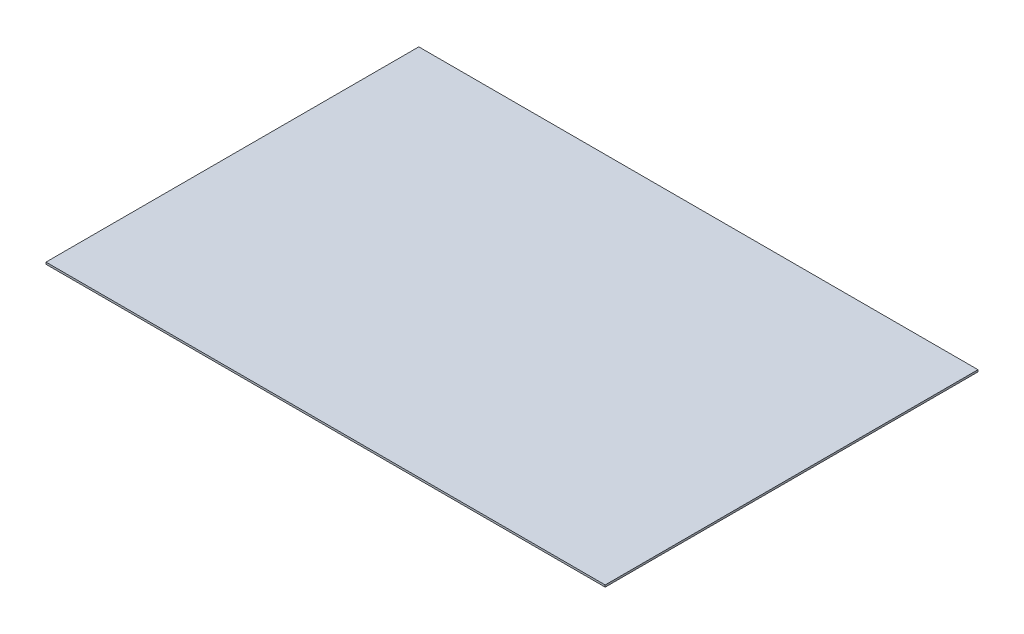
ISO-10303-21;
HEADER;
FILE_DESCRIPTION(('STEP AP214'),'2;1');
FILE_NAME('part.step','',(''),(''),'','','');
FILE_SCHEMA(('AUTOMOTIVE_DESIGN { 1 0 10303 214 1 1 1 1 }'));
ENDSEC;
DATA;
#1=APPLICATION_CONTEXT('core data for automotive mechanical design processes');
#2=APPLICATION_PROTOCOL_DEFINITION('international standard','automotive_design',2000,#1);
#3=PRODUCT_CONTEXT('',#1,'mechanical');
#4=PRODUCT('Part','Part','',(#3));
#5=PRODUCT_RELATED_PRODUCT_CATEGORY('part','',(#4));
#6=PRODUCT_DEFINITION_FORMATION('','',#4);
#7=PRODUCT_DEFINITION_CONTEXT('part definition',#1,'design');
#8=PRODUCT_DEFINITION('design','',#6,#7);
#9=PRODUCT_DEFINITION_SHAPE('','',#8);
#10=(LENGTH_UNIT() NAMED_UNIT(*) SI_UNIT(.MILLI.,.METRE.));
#11=(NAMED_UNIT(*) PLANE_ANGLE_UNIT() SI_UNIT($,.RADIAN.));
#12=(NAMED_UNIT(*) SI_UNIT($,.STERADIAN.) SOLID_ANGLE_UNIT());
#13=UNCERTAINTY_MEASURE_WITH_UNIT(LENGTH_MEASURE(1.E-05),#10,'distance_accuracy_value','');
#14=(GEOMETRIC_REPRESENTATION_CONTEXT(3) GLOBAL_UNCERTAINTY_ASSIGNED_CONTEXT((#13)) GLOBAL_UNIT_ASSIGNED_CONTEXT((#10,
#11,#12)) REPRESENTATION_CONTEXT('',''));
#15=CARTESIAN_POINT('',(0.,0.,0.));
#16=DIRECTION('',(0.,0.,1.));
#17=DIRECTION('',(1.,0.,0.));
#18=AXIS2_PLACEMENT_3D('',#15,#16,#17);
#19=CARTESIAN_POINT('',(914.4,6.35,-609.6));
#20=DIRECTION('',(-1.,0.,0.));
#21=DIRECTION('',(0.,0.,1.));
#22=AXIS2_PLACEMENT_3D('',#19,#20,#21);
#23=PLANE('',#22);
#24=DIRECTION('',(0.,0.,-1.));
#25=VECTOR('',#24,1.);
#26=CARTESIAN_POINT('',(914.4,0.,-609.6));
#27=LINE('',#26,#25);
#28=CARTESIAN_POINT('',(914.4,0.,609.6));
#29=VERTEX_POINT('',#28);
#30=CARTESIAN_POINT('',(914.4,0.,-609.6));
#31=VERTEX_POINT('',#30);
#32=EDGE_CURVE('E98',#29,#31,#27,.T.);
#33=ORIENTED_EDGE('',*,*,#32,.T.);
#34=DIRECTION('',(0.,-1.,0.));
#35=VECTOR('',#34,1.);
#36=CARTESIAN_POINT('',(914.4,6.35,-609.6));
#37=LINE('',#36,#35);
#38=CARTESIAN_POINT('',(914.4,6.35,-609.6));
#39=VERTEX_POINT('',#38);
#40=EDGE_CURVE('E11',#39,#31,#37,.T.);
#41=ORIENTED_EDGE('',*,*,#40,.F.);
#42=DIRECTION('',(0.,0.,-1.));
#43=VECTOR('',#42,1.);
#44=CARTESIAN_POINT('',(914.4,6.35,-609.6));
#45=LINE('',#44,#43);
#46=CARTESIAN_POINT('',(914.4,6.35,609.6));
#47=VERTEX_POINT('',#46);
#48=EDGE_CURVE('E86',#47,#39,#45,.T.);
#49=ORIENTED_EDGE('',*,*,#48,.F.);
#50=DIRECTION('',(0.,-1.,0.));
#51=VECTOR('',#50,1.);
#52=CARTESIAN_POINT('',(914.4,6.35,609.6));
#53=LINE('',#52,#51);
#54=EDGE_CURVE('E94',#47,#29,#53,.T.);
#55=ORIENTED_EDGE('',*,*,#54,.T.);
#56=EDGE_LOOP('',(#33,#41,#49,#55));
#57=FACE_BOUND('',#56,.T.);
#58=ADVANCED_FACE('F35',(#57),#23,.F.);
#59=CARTESIAN_POINT('',(-914.4,6.35,-609.6));
#60=DIRECTION('',(0.,0.,1.));
#61=DIRECTION('',(1.,0.,0.));
#62=AXIS2_PLACEMENT_3D('',#59,#60,#61);
#63=PLANE('',#62);
#64=DIRECTION('',(-1.,0.,0.));
#65=VECTOR('',#64,1.);
#66=CARTESIAN_POINT('',(-914.4,0.,-609.6));
#67=LINE('',#66,#65);
#68=CARTESIAN_POINT('',(-914.4,0.,-609.6));
#69=VERTEX_POINT('',#68);
#70=EDGE_CURVE('E90',#31,#69,#67,.T.);
#71=ORIENTED_EDGE('',*,*,#70,.T.);
#72=DIRECTION('',(0.,-1.,0.));
#73=VECTOR('',#72,1.);
#74=CARTESIAN_POINT('',(-914.4,6.35,-609.6));
#75=LINE('',#74,#73);
#76=CARTESIAN_POINT('',(-914.4,6.35,-609.6));
#77=VERTEX_POINT('',#76);
#78=EDGE_CURVE('E43',#77,#69,#75,.T.);
#79=ORIENTED_EDGE('',*,*,#78,.F.);
#80=DIRECTION('',(-1.,0.,0.));
#81=VECTOR('',#80,1.);
#82=CARTESIAN_POINT('',(-914.4,6.35,-609.6));
#83=LINE('',#82,#81);
#84=EDGE_CURVE('E81',#39,#77,#83,.T.);
#85=ORIENTED_EDGE('',*,*,#84,.F.);
#86=ORIENTED_EDGE('',*,*,#40,.T.);
#87=EDGE_LOOP('',(#71,#79,#85,#86));
#88=FACE_BOUND('',#87,.T.);
#89=ADVANCED_FACE('F89',(#88),#63,.F.);
#90=CARTESIAN_POINT('',(-914.4,6.35,-609.6));
#91=DIRECTION('',(1.,0.,0.));
#92=DIRECTION('',(0.,0.,-1.));
#93=AXIS2_PLACEMENT_3D('',#90,#91,#92);
#94=PLANE('',#93);
#95=DIRECTION('',(0.,0.,1.));
#96=VECTOR('',#95,1.);
#97=CARTESIAN_POINT('',(-914.4,0.,-609.6));
#98=LINE('',#97,#96);
#99=CARTESIAN_POINT('',(-914.4,0.,609.6));
#100=VERTEX_POINT('',#99);
#101=EDGE_CURVE('E68',#69,#100,#98,.T.);
#102=ORIENTED_EDGE('',*,*,#101,.T.);
#103=DIRECTION('',(0.,-1.,0.));
#104=VECTOR('',#103,1.);
#105=CARTESIAN_POINT('',(-914.4,6.35,609.6));
#106=LINE('',#105,#104);
#107=CARTESIAN_POINT('',(-914.4,6.35,609.6));
#108=VERTEX_POINT('',#107);
#109=EDGE_CURVE('E91',#108,#100,#106,.T.);
#110=ORIENTED_EDGE('',*,*,#109,.F.);
#111=DIRECTION('',(0.,0.,1.));
#112=VECTOR('',#111,1.);
#113=CARTESIAN_POINT('',(-914.4,6.35,-609.6));
#114=LINE('',#113,#112);
#115=EDGE_CURVE('E84',#77,#108,#114,.T.);
#116=ORIENTED_EDGE('',*,*,#115,.F.);
#117=ORIENTED_EDGE('',*,*,#78,.T.);
#118=EDGE_LOOP('',(#102,#110,#116,#117));
#119=FACE_BOUND('',#118,.T.);
#120=ADVANCED_FACE('F92',(#119),#94,.F.);
#121=CARTESIAN_POINT('',(-914.4,6.35,609.6));
#122=DIRECTION('',(0.,0.,-1.));
#123=DIRECTION('',(-1.,0.,0.));
#124=AXIS2_PLACEMENT_3D('',#121,#122,#123);
#125=PLANE('',#124);
#126=DIRECTION('',(1.,0.,0.));
#127=VECTOR('',#126,1.);
#128=CARTESIAN_POINT('',(-914.4,0.,609.6));
#129=LINE('',#128,#127);
#130=EDGE_CURVE('E74',#100,#29,#129,.T.);
#131=ORIENTED_EDGE('',*,*,#130,.T.);
#132=ORIENTED_EDGE('',*,*,#54,.F.);
#133=DIRECTION('',(1.,0.,0.));
#134=VECTOR('',#133,1.);
#135=CARTESIAN_POINT('',(-914.4,6.35,609.6));
#136=LINE('',#135,#134);
#137=EDGE_CURVE('E51',#108,#47,#136,.T.);
#138=ORIENTED_EDGE('',*,*,#137,.F.);
#139=ORIENTED_EDGE('',*,*,#109,.T.);
#140=EDGE_LOOP('',(#131,#132,#138,#139));
#141=FACE_BOUND('',#140,.T.);
#142=ADVANCED_FACE('F105',(#141),#125,.F.);
#143=CARTESIAN_POINT('',(0.,6.35,0.));
#144=DIRECTION('',(0.,1.,0.));
#145=DIRECTION('',(0.,0.,1.));
#146=AXIS2_PLACEMENT_3D('',#143,#144,#145);
#147=PLANE('',#146);
#148=ORIENTED_EDGE('',*,*,#48,.T.);
#149=ORIENTED_EDGE('',*,*,#84,.T.);
#150=ORIENTED_EDGE('',*,*,#115,.T.);
#151=ORIENTED_EDGE('',*,*,#137,.T.);
#152=EDGE_LOOP('',(#148,#149,#150,#151));
#153=FACE_BOUND('',#152,.T.);
#154=ADVANCED_FACE('F82',(#153),#147,.T.);
#155=CARTESIAN_POINT('',(0.,0.,0.));
#156=DIRECTION('',(0.,1.,0.));
#157=DIRECTION('',(0.,0.,1.));
#158=AXIS2_PLACEMENT_3D('',#155,#156,#157);
#159=PLANE('',#158);
#160=ORIENTED_EDGE('',*,*,#32,.F.);
#161=ORIENTED_EDGE('',*,*,#130,.F.);
#162=ORIENTED_EDGE('',*,*,#101,.F.);
#163=ORIENTED_EDGE('',*,*,#70,.F.);
#164=EDGE_LOOP('',(#160,#161,#162,#163));
#165=FACE_BOUND('',#164,.T.);
#166=ADVANCED_FACE('F108',(#165),#159,.F.);
#167=CLOSED_SHELL('',(#58,#89,#120,#142,#154,#166));
#168=MANIFOLD_SOLID_BREP('B2',#167);
#169=ADVANCED_BREP_SHAPE_REPRESENTATION('',(#18,#168),#14);
#170=SHAPE_DEFINITION_REPRESENTATION(#9,#169);
ENDSEC;
END-ISO-10303-21;
